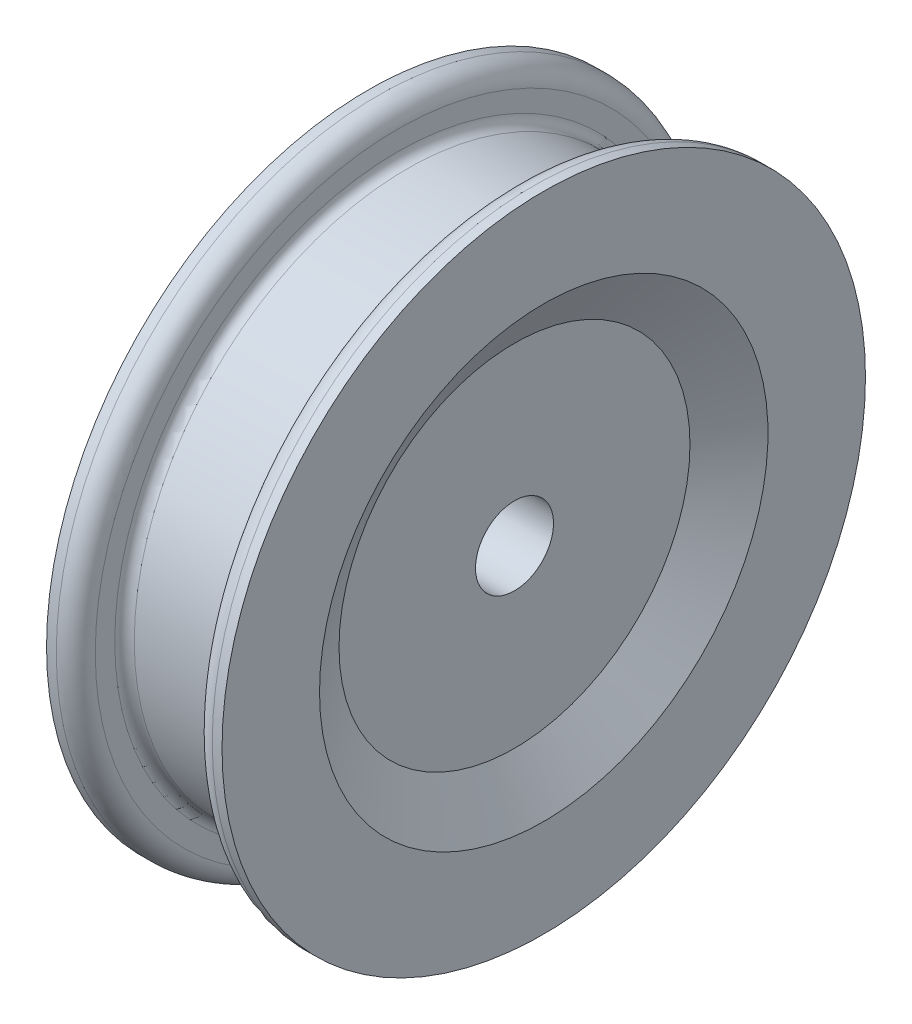
ISO-10303-21;
HEADER;
FILE_DESCRIPTION(('STEP AP214'),'2;1');
FILE_NAME('part.step','',(''),(''),'','','');
FILE_SCHEMA(('AUTOMOTIVE_DESIGN { 1 0 10303 214 1 1 1 1 }'));
ENDSEC;
DATA;
#1=APPLICATION_CONTEXT('core data for automotive mechanical design processes');
#2=APPLICATION_PROTOCOL_DEFINITION('international standard','automotive_design',2000,#1);
#3=PRODUCT_CONTEXT('',#1,'mechanical');
#4=PRODUCT('Part','Part','',(#3));
#5=PRODUCT_RELATED_PRODUCT_CATEGORY('part','',(#4));
#6=PRODUCT_DEFINITION_FORMATION('','',#4);
#7=PRODUCT_DEFINITION_CONTEXT('part definition',#1,'design');
#8=PRODUCT_DEFINITION('design','',#6,#7);
#9=PRODUCT_DEFINITION_SHAPE('','',#8);
#10=(LENGTH_UNIT() NAMED_UNIT(*) SI_UNIT(.MILLI.,.METRE.));
#11=(NAMED_UNIT(*) PLANE_ANGLE_UNIT() SI_UNIT($,.RADIAN.));
#12=(NAMED_UNIT(*) SI_UNIT($,.STERADIAN.) SOLID_ANGLE_UNIT());
#13=UNCERTAINTY_MEASURE_WITH_UNIT(LENGTH_MEASURE(1.E-05),#10,'distance_accuracy_value','');
#14=(GEOMETRIC_REPRESENTATION_CONTEXT(3) GLOBAL_UNCERTAINTY_ASSIGNED_CONTEXT((#13)) GLOBAL_UNIT_ASSIGNED_CONTEXT((#10,
#11,#12)) REPRESENTATION_CONTEXT('',''));
#15=CARTESIAN_POINT('',(0.,0.,0.));
#16=DIRECTION('',(0.,0.,1.));
#17=DIRECTION('',(1.,0.,0.));
#18=AXIS2_PLACEMENT_3D('',#15,#16,#17);
#19=CARTESIAN_POINT('',(1.5,4.5,0.));
#20=DIRECTION('',(-1.,0.,0.));
#21=DIRECTION('',(0.,0.,1.));
#22=AXIS2_PLACEMENT_3D('',#19,#20,#21);
#23=PLANE('',#22);
#24=CARTESIAN_POINT('',(1.5,0.,0.));
#25=DIRECTION('',(-1.,0.,0.));
#26=DIRECTION('',(0.,0.,1.));
#27=AXIS2_PLACEMENT_3D('',#24,#25,#26);
#28=CIRCLE('',#27,4.5);
#29=CARTESIAN_POINT('',(1.5,0.,4.5));
#30=VERTEX_POINT('',#29);
#31=EDGE_CURVE('E64',#30,#30,#28,.T.);
#32=ORIENTED_EDGE('',*,*,#31,.F.);
#33=EDGE_LOOP('',(#32));
#34=FACE_BOUND('',#33,.T.);
#35=CARTESIAN_POINT('',(1.5,0.,0.));
#36=DIRECTION('',(-1.,0.,0.));
#37=DIRECTION('',(0.,0.,1.));
#38=AXIS2_PLACEMENT_3D('',#35,#36,#37);
#39=CIRCLE('',#38,1.);
#40=CARTESIAN_POINT('',(1.5,0.,1.));
#41=VERTEX_POINT('',#40);
#42=EDGE_CURVE('E97',#41,#41,#39,.T.);
#43=ORIENTED_EDGE('',*,*,#42,.T.);
#44=EDGE_LOOP('',(#43));
#45=FACE_BOUND('',#44,.T.);
#46=ADVANCED_FACE('F44',(#34,#45),#23,.F.);
#47=CARTESIAN_POINT('',(1.5,0.,0.));
#48=DIRECTION('',(1.,0.,0.));
#49=DIRECTION('',(0.,0.,-1.));
#50=AXIS2_PLACEMENT_3D('',#47,#48,#49);
#51=CONICAL_SURFACE('',#50,4.5,1.03037682652431);
#52=CARTESIAN_POINT('',(2.25,0.,0.));
#53=DIRECTION('',(-1.,0.,0.));
#54=DIRECTION('',(0.,0.,1.));
#55=AXIS2_PLACEMENT_3D('',#52,#53,#54);
#56=CIRCLE('',#55,5.74999999999999);
#57=CARTESIAN_POINT('',(2.25,0.,5.74999999999999));
#58=VERTEX_POINT('',#57);
#59=EDGE_CURVE('E67',#58,#58,#56,.T.);
#60=ORIENTED_EDGE('',*,*,#59,.F.);
#61=EDGE_LOOP('',(#60));
#62=FACE_BOUND('',#61,.T.);
#63=ORIENTED_EDGE('',*,*,#31,.T.);
#64=EDGE_LOOP('',(#63));
#65=FACE_BOUND('',#64,.T.);
#66=ADVANCED_FACE('F139',(#62,#65),#51,.F.);
#67=CARTESIAN_POINT('',(2.25,8.24999999999999,0.));
#68=DIRECTION('',(-1.,0.,0.));
#69=DIRECTION('',(0.,0.,1.));
#70=AXIS2_PLACEMENT_3D('',#67,#68,#69);
#71=PLANE('',#70);
#72=CARTESIAN_POINT('',(2.25,0.,0.));
#73=DIRECTION('',(-1.,0.,0.));
#74=DIRECTION('',(0.,0.,1.));
#75=AXIS2_PLACEMENT_3D('',#72,#73,#74);
#76=CIRCLE('',#75,8.24999999999999);
#77=CARTESIAN_POINT('',(2.25,0.,8.24999999999999));
#78=VERTEX_POINT('',#77);
#79=EDGE_CURVE('E70',#78,#78,#76,.T.);
#80=ORIENTED_EDGE('',*,*,#79,.F.);
#81=EDGE_LOOP('',(#80));
#82=FACE_BOUND('',#81,.T.);
#83=ORIENTED_EDGE('',*,*,#59,.T.);
#84=EDGE_LOOP('',(#83));
#85=FACE_BOUND('',#84,.T.);
#86=ADVANCED_FACE('F145',(#82,#85),#71,.F.);
#87=CARTESIAN_POINT('',(0.,0.,0.));
#88=DIRECTION('',(-1.,0.,0.));
#89=DIRECTION('',(0.,0.,1.));
#90=AXIS2_PLACEMENT_3D('',#87,#88,#89);
#91=CYLINDRICAL_SURFACE('',#90,8.25);
#92=CARTESIAN_POINT('',(2.,0.,0.));
#93=DIRECTION('',(1.,0.,0.));
#94=DIRECTION('',(0.,0.,-1.));
#95=AXIS2_PLACEMENT_3D('',#92,#93,#94);
#96=CIRCLE('',#95,8.25);
#97=CARTESIAN_POINT('',(2.,0.,-8.25));
#98=VERTEX_POINT('',#97);
#99=EDGE_CURVE('E12',#98,#98,#96,.T.);
#100=ORIENTED_EDGE('',*,*,#99,.T.);
#101=EDGE_LOOP('',(#100));
#102=FACE_BOUND('',#101,.T.);
#103=ORIENTED_EDGE('',*,*,#79,.T.);
#104=EDGE_LOOP('',(#103));
#105=FACE_BOUND('',#104,.T.);
#106=ADVANCED_FACE('F181',(#102,#105),#91,.T.);
#107=CARTESIAN_POINT('',(1.5,8.25,0.));
#108=DIRECTION('',(1.,0.,0.));
#109=DIRECTION('',(0.,0.,-1.));
#110=AXIS2_PLACEMENT_3D('',#107,#108,#109);
#111=PLANE('',#110);
#112=CARTESIAN_POINT('',(1.5,0.,0.));
#113=DIRECTION('',(1.,0.,0.));
#114=DIRECTION('',(0.,0.,-1.));
#115=AXIS2_PLACEMENT_3D('',#112,#113,#114);
#116=CIRCLE('',#115,7.75);
#117=CARTESIAN_POINT('',(1.5,0.,-7.75));
#118=VERTEX_POINT('',#117);
#119=EDGE_CURVE('E51',#118,#118,#116,.F.);
#120=ORIENTED_EDGE('',*,*,#119,.T.);
#121=EDGE_LOOP('',(#120));
#122=FACE_BOUND('',#121,.T.);
#123=CARTESIAN_POINT('',(1.5,0.,0.));
#124=DIRECTION('',(-1.,0.,0.));
#125=DIRECTION('',(0.,0.,1.));
#126=AXIS2_PLACEMENT_3D('',#123,#124,#125);
#127=CIRCLE('',#126,7.25);
#128=CARTESIAN_POINT('',(1.5,0.,7.25));
#129=VERTEX_POINT('',#128);
#130=EDGE_CURVE('E73',#129,#129,#127,.T.);
#131=ORIENTED_EDGE('',*,*,#130,.F.);
#132=EDGE_LOOP('',(#131));
#133=FACE_BOUND('',#132,.T.);
#134=ADVANCED_FACE('F176',(#122,#133),#111,.F.);
#135=CARTESIAN_POINT('',(1.25,0.,0.));
#136=DIRECTION('',(-1.,0.,0.));
#137=DIRECTION('',(0.,0.,1.));
#138=AXIS2_PLACEMENT_3D('',#135,#136,#137);
#139=TOROIDAL_SURFACE('',#138,7.25,0.25);
#140=CARTESIAN_POINT('',(1.25,0.,0.));
#141=DIRECTION('',(-1.,0.,0.));
#142=DIRECTION('',(0.,0.,1.));
#143=AXIS2_PLACEMENT_3D('',#140,#141,#142);
#144=CIRCLE('',#143,7.);
#145=CARTESIAN_POINT('',(1.25,0.,7.));
#146=VERTEX_POINT('',#145);
#147=EDGE_CURVE('E76',#146,#146,#144,.T.);
#148=ORIENTED_EDGE('',*,*,#147,.F.);
#149=EDGE_LOOP('',(#148));
#150=FACE_BOUND('',#149,.T.);
#151=ORIENTED_EDGE('',*,*,#130,.T.);
#152=EDGE_LOOP('',(#151));
#153=FACE_BOUND('',#152,.T.);
#154=ADVANCED_FACE('F170',(#150,#153),#139,.F.);
#155=CARTESIAN_POINT('',(0.,0.,0.));
#156=DIRECTION('',(-1.,0.,0.));
#157=DIRECTION('',(0.,0.,1.));
#158=AXIS2_PLACEMENT_3D('',#155,#156,#157);
#159=CYLINDRICAL_SURFACE('',#158,7.);
#160=CARTESIAN_POINT('',(-1.25,0.,0.));
#161=DIRECTION('',(-1.,0.,0.));
#162=DIRECTION('',(0.,0.,1.));
#163=AXIS2_PLACEMENT_3D('',#160,#161,#162);
#164=CIRCLE('',#163,7.);
#165=CARTESIAN_POINT('',(-1.25,0.,7.));
#166=VERTEX_POINT('',#165);
#167=EDGE_CURVE('E79',#166,#166,#164,.T.);
#168=ORIENTED_EDGE('',*,*,#167,.F.);
#169=EDGE_LOOP('',(#168));
#170=FACE_BOUND('',#169,.T.);
#171=ORIENTED_EDGE('',*,*,#147,.T.);
#172=EDGE_LOOP('',(#171));
#173=FACE_BOUND('',#172,.T.);
#174=ADVANCED_FACE('F164',(#170,#173),#159,.T.);
#175=CARTESIAN_POINT('',(-1.25,0.,0.));
#176=DIRECTION('',(-1.,0.,0.));
#177=DIRECTION('',(0.,0.,1.));
#178=AXIS2_PLACEMENT_3D('',#175,#176,#177);
#179=TOROIDAL_SURFACE('',#178,7.25,0.25);
#180=CARTESIAN_POINT('',(-1.5,0.,0.));
#181=DIRECTION('',(-1.,0.,0.));
#182=DIRECTION('',(0.,0.,1.));
#183=AXIS2_PLACEMENT_3D('',#180,#181,#182);
#184=CIRCLE('',#183,7.25);
#185=CARTESIAN_POINT('',(-1.5,0.,7.25));
#186=VERTEX_POINT('',#185);
#187=EDGE_CURVE('E82',#186,#186,#184,.T.);
#188=ORIENTED_EDGE('',*,*,#187,.F.);
#189=EDGE_LOOP('',(#188));
#190=FACE_BOUND('',#189,.T.);
#191=ORIENTED_EDGE('',*,*,#167,.T.);
#192=EDGE_LOOP('',(#191));
#193=FACE_BOUND('',#192,.T.);
#194=ADVANCED_FACE('F135',(#190,#193),#179,.F.);
#195=CARTESIAN_POINT('',(-1.5,8.25,0.));
#196=DIRECTION('',(-1.,0.,0.));
#197=DIRECTION('',(0.,0.,1.));
#198=AXIS2_PLACEMENT_3D('',#195,#196,#197);
#199=PLANE('',#198);
#200=CARTESIAN_POINT('',(-1.5,0.,0.));
#201=DIRECTION('',(-1.,0.,0.));
#202=DIRECTION('',(0.,0.,1.));
#203=AXIS2_PLACEMENT_3D('',#200,#201,#202);
#204=CIRCLE('',#203,7.75);
#205=CARTESIAN_POINT('',(-1.5,0.,7.75));
#206=VERTEX_POINT('',#205);
#207=EDGE_CURVE('E55',#206,#206,#204,.F.);
#208=ORIENTED_EDGE('',*,*,#207,.T.);
#209=EDGE_LOOP('',(#208));
#210=FACE_BOUND('',#209,.T.);
#211=ORIENTED_EDGE('',*,*,#187,.T.);
#212=EDGE_LOOP('',(#211));
#213=FACE_BOUND('',#212,.T.);
#214=ADVANCED_FACE('F129',(#210,#213),#199,.F.);
#215=CARTESIAN_POINT('',(0.,0.,0.));
#216=DIRECTION('',(-1.,0.,0.));
#217=DIRECTION('',(0.,0.,1.));
#218=AXIS2_PLACEMENT_3D('',#215,#216,#217);
#219=CYLINDRICAL_SURFACE('',#218,8.25);
#220=CARTESIAN_POINT('',(-2.,0.,0.));
#221=DIRECTION('',(-1.,0.,0.));
#222=DIRECTION('',(0.,0.,1.));
#223=AXIS2_PLACEMENT_3D('',#220,#221,#222);
#224=CIRCLE('',#223,8.25);
#225=CARTESIAN_POINT('',(-2.,0.,8.25));
#226=VERTEX_POINT('',#225);
#227=EDGE_CURVE('E59',#226,#226,#224,.T.);
#228=ORIENTED_EDGE('',*,*,#227,.T.);
#229=EDGE_LOOP('',(#228));
#230=FACE_BOUND('',#229,.T.);
#231=CARTESIAN_POINT('',(-2.25,0.,0.));
#232=DIRECTION('',(-1.,0.,0.));
#233=DIRECTION('',(0.,0.,1.));
#234=AXIS2_PLACEMENT_3D('',#231,#232,#233);
#235=CIRCLE('',#234,8.24999999999999);
#236=CARTESIAN_POINT('',(-2.25,0.,8.24999999999999));
#237=VERTEX_POINT('',#236);
#238=EDGE_CURVE('E85',#237,#237,#235,.T.);
#239=ORIENTED_EDGE('',*,*,#238,.F.);
#240=EDGE_LOOP('',(#239));
#241=FACE_BOUND('',#240,.T.);
#242=ADVANCED_FACE('F124',(#230,#241),#219,.T.);
#243=CARTESIAN_POINT('',(-2.25,8.24999999999999,0.));
#244=DIRECTION('',(1.,0.,0.));
#245=DIRECTION('',(0.,0.,-1.));
#246=AXIS2_PLACEMENT_3D('',#243,#244,#245);
#247=PLANE('',#246);
#248=CARTESIAN_POINT('',(-2.25,0.,0.));
#249=DIRECTION('',(-1.,0.,0.));
#250=DIRECTION('',(0.,0.,1.));
#251=AXIS2_PLACEMENT_3D('',#248,#249,#250);
#252=CIRCLE('',#251,5.74999999999999);
#253=CARTESIAN_POINT('',(-2.25,0.,5.74999999999999));
#254=VERTEX_POINT('',#253);
#255=EDGE_CURVE('E88',#254,#254,#252,.T.);
#256=ORIENTED_EDGE('',*,*,#255,.F.);
#257=EDGE_LOOP('',(#256));
#258=FACE_BOUND('',#257,.T.);
#259=ORIENTED_EDGE('',*,*,#238,.T.);
#260=EDGE_LOOP('',(#259));
#261=FACE_BOUND('',#260,.T.);
#262=ADVANCED_FACE('F118',(#258,#261),#247,.F.);
#263=CARTESIAN_POINT('',(-2.25,0.,0.));
#264=DIRECTION('',(-1.,0.,0.));
#265=DIRECTION('',(0.,0.,1.));
#266=AXIS2_PLACEMENT_3D('',#263,#264,#265);
#267=CONICAL_SURFACE('',#266,5.74999999999999,1.03037682652431);
#268=CARTESIAN_POINT('',(-1.5,0.,0.));
#269=DIRECTION('',(-1.,0.,0.));
#270=DIRECTION('',(0.,0.,1.));
#271=AXIS2_PLACEMENT_3D('',#268,#269,#270);
#272=CIRCLE('',#271,4.5);
#273=CARTESIAN_POINT('',(-1.5,0.,4.5));
#274=VERTEX_POINT('',#273);
#275=EDGE_CURVE('E91',#274,#274,#272,.T.);
#276=ORIENTED_EDGE('',*,*,#275,.F.);
#277=EDGE_LOOP('',(#276));
#278=FACE_BOUND('',#277,.T.);
#279=ORIENTED_EDGE('',*,*,#255,.T.);
#280=EDGE_LOOP('',(#279));
#281=FACE_BOUND('',#280,.T.);
#282=ADVANCED_FACE('F112',(#278,#281),#267,.F.);
#283=CARTESIAN_POINT('',(-1.5,4.5,0.));
#284=DIRECTION('',(1.,0.,0.));
#285=DIRECTION('',(0.,0.,-1.));
#286=AXIS2_PLACEMENT_3D('',#283,#284,#285);
#287=PLANE('',#286);
#288=CARTESIAN_POINT('',(-1.5,0.,0.));
#289=DIRECTION('',(-1.,0.,0.));
#290=DIRECTION('',(0.,0.,1.));
#291=AXIS2_PLACEMENT_3D('',#288,#289,#290);
#292=CIRCLE('',#291,1.);
#293=CARTESIAN_POINT('',(-1.5,0.,1.));
#294=VERTEX_POINT('',#293);
#295=EDGE_CURVE('E94',#294,#294,#292,.T.);
#296=ORIENTED_EDGE('',*,*,#295,.F.);
#297=EDGE_LOOP('',(#296));
#298=FACE_BOUND('',#297,.T.);
#299=ORIENTED_EDGE('',*,*,#275,.T.);
#300=EDGE_LOOP('',(#299));
#301=FACE_BOUND('',#300,.T.);
#302=ADVANCED_FACE('F106',(#298,#301),#287,.F.);
#303=CARTESIAN_POINT('',(0.,0.,0.));
#304=DIRECTION('',(-1.,0.,0.));
#305=DIRECTION('',(0.,0.,1.));
#306=AXIS2_PLACEMENT_3D('',#303,#304,#305);
#307=CYLINDRICAL_SURFACE('',#306,1.);
#308=ORIENTED_EDGE('',*,*,#42,.F.);
#309=EDGE_LOOP('',(#308));
#310=FACE_BOUND('',#309,.T.);
#311=ORIENTED_EDGE('',*,*,#295,.T.);
#312=EDGE_LOOP('',(#311));
#313=FACE_BOUND('',#312,.T.);
#314=ADVANCED_FACE('F102',(#310,#313),#307,.F.);
#315=CARTESIAN_POINT('',(-2.,0.,0.));
#316=DIRECTION('',(-1.,0.,0.));
#317=DIRECTION('',(0.,0.,1.));
#318=AXIS2_PLACEMENT_3D('',#315,#316,#317);
#319=TOROIDAL_SURFACE('',#318,7.75,0.5);
#320=ORIENTED_EDGE('',*,*,#207,.F.);
#321=EDGE_LOOP('',(#320));
#322=FACE_BOUND('',#321,.T.);
#323=ORIENTED_EDGE('',*,*,#227,.F.);
#324=EDGE_LOOP('',(#323));
#325=FACE_BOUND('',#324,.T.);
#326=ADVANCED_FACE('F105',(#322,#325),#319,.T.);
#327=CARTESIAN_POINT('',(2.,0.,0.));
#328=DIRECTION('',(1.,0.,0.));
#329=DIRECTION('',(0.,0.,-1.));
#330=AXIS2_PLACEMENT_3D('',#327,#328,#329);
#331=TOROIDAL_SURFACE('',#330,7.75,0.5);
#332=ORIENTED_EDGE('',*,*,#99,.F.);
#333=EDGE_LOOP('',(#332));
#334=FACE_BOUND('',#333,.T.);
#335=ORIENTED_EDGE('',*,*,#119,.F.);
#336=EDGE_LOOP('',(#335));
#337=FACE_BOUND('',#336,.T.);
#338=ADVANCED_FACE('F46',(#334,#337),#331,.T.);
#339=CLOSED_SHELL('',(#46,#66,#86,#106,#134,#154,#174,#194,#214,#242,#262,#282,#302,#314,#326,#338));
#340=MANIFOLD_SOLID_BREP('B2',#339);
#341=ADVANCED_BREP_SHAPE_REPRESENTATION('',(#18,#340),#14);
#342=SHAPE_DEFINITION_REPRESENTATION(#9,#341);
ENDSEC;
END-ISO-10303-21;
